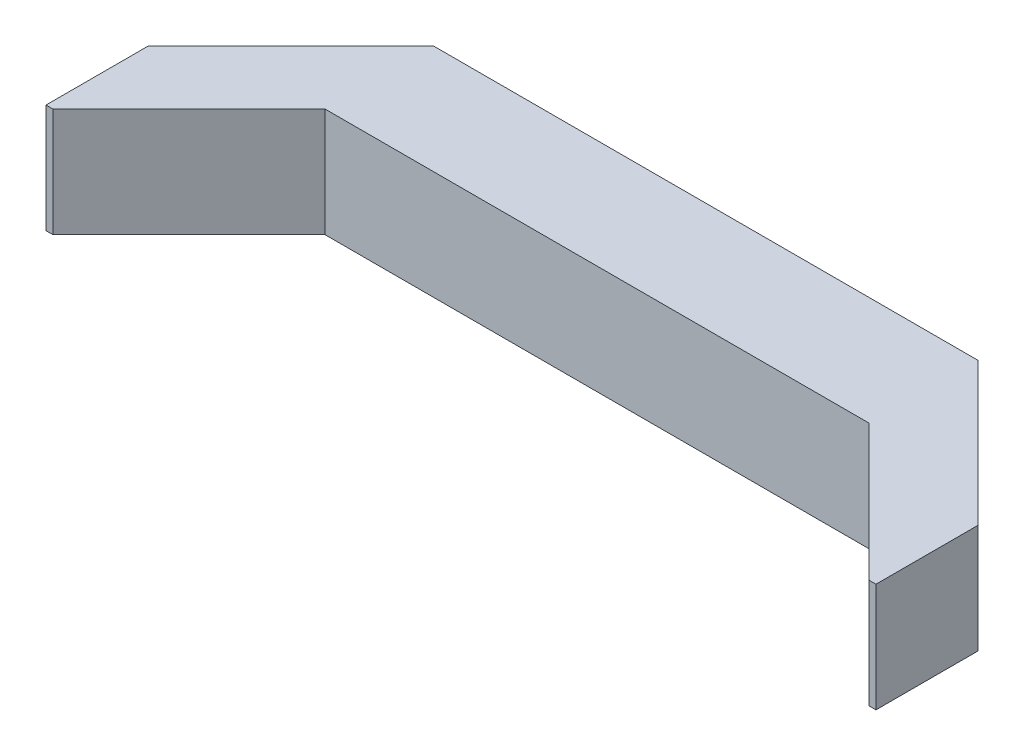
ISO-10303-21;
HEADER;
FILE_DESCRIPTION(('STEP AP214'),'2;1');
FILE_NAME('part.step','',(''),(''),'','','');
FILE_SCHEMA(('AUTOMOTIVE_DESIGN { 1 0 10303 214 1 1 1 1 }'));
ENDSEC;
DATA;
#1=APPLICATION_CONTEXT('core data for automotive mechanical design processes');
#2=APPLICATION_PROTOCOL_DEFINITION('international standard','automotive_design',2000,#1);
#3=PRODUCT_CONTEXT('',#1,'mechanical');
#4=PRODUCT('Part','Part','',(#3));
#5=PRODUCT_RELATED_PRODUCT_CATEGORY('part','',(#4));
#6=PRODUCT_DEFINITION_FORMATION('','',#4);
#7=PRODUCT_DEFINITION_CONTEXT('part definition',#1,'design');
#8=PRODUCT_DEFINITION('design','',#6,#7);
#9=PRODUCT_DEFINITION_SHAPE('','',#8);
#10=(LENGTH_UNIT() NAMED_UNIT(*) SI_UNIT(.MILLI.,.METRE.));
#11=(NAMED_UNIT(*) PLANE_ANGLE_UNIT() SI_UNIT($,.RADIAN.));
#12=(NAMED_UNIT(*) SI_UNIT($,.STERADIAN.) SOLID_ANGLE_UNIT());
#13=UNCERTAINTY_MEASURE_WITH_UNIT(LENGTH_MEASURE(1.E-05),#10,'distance_accuracy_value','');
#14=(GEOMETRIC_REPRESENTATION_CONTEXT(3) GLOBAL_UNCERTAINTY_ASSIGNED_CONTEXT((#13)) GLOBAL_UNIT_ASSIGNED_CONTEXT((#10,
#11,#12)) REPRESENTATION_CONTEXT('',''));
#15=CARTESIAN_POINT('',(0.,0.,0.));
#16=DIRECTION('',(0.,0.,1.));
#17=DIRECTION('',(1.,0.,0.));
#18=AXIS2_PLACEMENT_3D('',#15,#16,#17);
#19=CARTESIAN_POINT('',(0.,0.,406.4));
#20=DIRECTION('',(0.,1.,0.));
#21=DIRECTION('',(0.,0.,1.));
#22=AXIS2_PLACEMENT_3D('',#19,#20,#21);
#23=PLANE('',#22);
#24=DIRECTION('',(1.,0.,0.));
#25=VECTOR('',#24,1.);
#26=CARTESIAN_POINT('',(0.,0.,0.));
#27=LINE('',#26,#25);
#28=CARTESIAN_POINT('',(0.,0.,0.));
#29=VERTEX_POINT('',#28);
#30=CARTESIAN_POINT('',(2032.,0.,0.));
#31=VERTEX_POINT('',#30);
#32=EDGE_CURVE('E61',#29,#31,#27,.T.);
#33=ORIENTED_EDGE('',*,*,#32,.T.);
#34=DIRECTION('',(0.707106781186549,0.,0.707106781186546));
#35=VECTOR('',#34,1.);
#36=CARTESIAN_POINT('',(2565.4,0.,533.4));
#37=LINE('',#36,#35);
#38=CARTESIAN_POINT('',(2565.4,0.,533.4));
#39=VERTEX_POINT('',#38);
#40=EDGE_CURVE('E162',#31,#39,#37,.T.);
#41=ORIENTED_EDGE('',*,*,#40,.T.);
#42=DIRECTION('',(0.,0.,1.));
#43=VECTOR('',#42,1.);
#44=CARTESIAN_POINT('',(2565.4,0.,914.4));
#45=LINE('',#44,#43);
#46=CARTESIAN_POINT('',(2565.4,0.,914.4));
#47=VERTEX_POINT('',#46);
#48=EDGE_CURVE('E177',#39,#47,#45,.T.);
#49=ORIENTED_EDGE('',*,*,#48,.T.);
#50=DIRECTION('',(-1.,0.,0.));
#51=VECTOR('',#50,1.);
#52=CARTESIAN_POINT('',(2539.99999999999,0.,914.4));
#53=LINE('',#52,#51);
#54=CARTESIAN_POINT('',(2539.99999999999,0.,914.4));
#55=VERTEX_POINT('',#54);
#56=EDGE_CURVE('E106',#47,#55,#53,.T.);
#57=ORIENTED_EDGE('',*,*,#56,.T.);
#58=DIRECTION('',(-0.707106781186544,0.,-0.707106781186552));
#59=VECTOR('',#58,1.);
#60=CARTESIAN_POINT('',(2032.,0.,406.4));
#61=LINE('',#60,#59);
#62=CARTESIAN_POINT('',(2032.,0.,406.4));
#63=VERTEX_POINT('',#62);
#64=EDGE_CURVE('E102',#55,#63,#61,.T.);
#65=ORIENTED_EDGE('',*,*,#64,.T.);
#66=DIRECTION('',(1.,0.,0.));
#67=VECTOR('',#66,1.);
#68=CARTESIAN_POINT('',(0.,0.,406.4));
#69=LINE('',#68,#67);
#70=CARTESIAN_POINT('',(0.,0.,406.4));
#71=VERTEX_POINT('',#70);
#72=EDGE_CURVE('E92',#71,#63,#69,.T.);
#73=ORIENTED_EDGE('',*,*,#72,.F.);
#74=DIRECTION('',(0.707106781186544,0.,-0.707106781186552));
#75=VECTOR('',#74,1.);
#76=CARTESIAN_POINT('',(0.,0.,406.4));
#77=LINE('',#76,#75);
#78=CARTESIAN_POINT('',(-507.999999999994,0.,914.4));
#79=VERTEX_POINT('',#78);
#80=EDGE_CURVE('E135',#79,#71,#77,.T.);
#81=ORIENTED_EDGE('',*,*,#80,.F.);
#82=DIRECTION('',(1.,0.,0.));
#83=VECTOR('',#82,1.);
#84=CARTESIAN_POINT('',(-507.999999999994,0.,914.4));
#85=LINE('',#84,#83);
#86=CARTESIAN_POINT('',(-533.400000000002,0.,914.4));
#87=VERTEX_POINT('',#86);
#88=EDGE_CURVE('E152',#87,#79,#85,.T.);
#89=ORIENTED_EDGE('',*,*,#88,.F.);
#90=DIRECTION('',(0.,0.,1.));
#91=VECTOR('',#90,1.);
#92=CARTESIAN_POINT('',(-533.400000000002,0.,914.4));
#93=LINE('',#92,#91);
#94=CARTESIAN_POINT('',(-533.400000000002,0.,533.4));
#95=VERTEX_POINT('',#94);
#96=EDGE_CURVE('E154',#95,#87,#93,.T.);
#97=ORIENTED_EDGE('',*,*,#96,.F.);
#98=DIRECTION('',(-0.707106781186549,0.,0.707106781186546));
#99=VECTOR('',#98,1.);
#100=CARTESIAN_POINT('',(-533.400000000002,0.,533.4));
#101=LINE('',#100,#99);
#102=EDGE_CURVE('E141',#29,#95,#101,.T.);
#103=ORIENTED_EDGE('',*,*,#102,.F.);
#104=EDGE_LOOP('',(#33,#41,#49,#57,#65,#73,#81,#89,#97,#103));
#105=FACE_BOUND('',#104,.T.);
#106=ADVANCED_FACE('F33',(#105),#23,.F.);
#107=CARTESIAN_POINT('',(2032.,406.4,406.4));
#108=DIRECTION('',(0.,-1.,0.));
#109=DIRECTION('',(0.,0.,-1.));
#110=AXIS2_PLACEMENT_3D('',#107,#108,#109);
#111=PLANE('',#110);
#112=DIRECTION('',(-1.,0.,0.));
#113=VECTOR('',#112,1.);
#114=CARTESIAN_POINT('',(2032.,406.4,0.));
#115=LINE('',#114,#113);
#116=CARTESIAN_POINT('',(2032.,406.4,0.));
#117=VERTEX_POINT('',#116);
#118=CARTESIAN_POINT('',(0.,406.4,0.));
#119=VERTEX_POINT('',#118);
#120=EDGE_CURVE('E36',#117,#119,#115,.T.);
#121=ORIENTED_EDGE('',*,*,#120,.T.);
#122=DIRECTION('',(-0.707106781186549,0.,0.707106781186546));
#123=VECTOR('',#122,1.);
#124=CARTESIAN_POINT('',(-533.400000000002,406.4,533.4));
#125=LINE('',#124,#123);
#126=CARTESIAN_POINT('',(-533.400000000002,406.4,533.4));
#127=VERTEX_POINT('',#126);
#128=EDGE_CURVE('E148',#119,#127,#125,.T.);
#129=ORIENTED_EDGE('',*,*,#128,.T.);
#130=DIRECTION('',(0.,0.,1.));
#131=VECTOR('',#130,1.);
#132=CARTESIAN_POINT('',(-533.400000000002,406.4,914.4));
#133=LINE('',#132,#131);
#134=CARTESIAN_POINT('',(-533.400000000002,406.4,914.4));
#135=VERTEX_POINT('',#134);
#136=EDGE_CURVE('E145',#127,#135,#133,.T.);
#137=ORIENTED_EDGE('',*,*,#136,.T.);
#138=DIRECTION('',(1.,0.,0.));
#139=VECTOR('',#138,1.);
#140=CARTESIAN_POINT('',(-507.999999999994,406.4,914.4));
#141=LINE('',#140,#139);
#142=CARTESIAN_POINT('',(-507.999999999994,406.4,914.4));
#143=VERTEX_POINT('',#142);
#144=EDGE_CURVE('E142',#135,#143,#141,.T.);
#145=ORIENTED_EDGE('',*,*,#144,.T.);
#146=DIRECTION('',(0.707106781186544,0.,-0.707106781186552));
#147=VECTOR('',#146,1.);
#148=CARTESIAN_POINT('',(0.,406.4,406.4));
#149=LINE('',#148,#147);
#150=CARTESIAN_POINT('',(0.,406.4,406.4));
#151=VERTEX_POINT('',#150);
#152=EDGE_CURVE('E138',#143,#151,#149,.T.);
#153=ORIENTED_EDGE('',*,*,#152,.T.);
#154=DIRECTION('',(-1.,0.,0.));
#155=VECTOR('',#154,1.);
#156=CARTESIAN_POINT('',(2032.,406.4,406.4));
#157=LINE('',#156,#155);
#158=CARTESIAN_POINT('',(2032.,406.4,406.4));
#159=VERTEX_POINT('',#158);
#160=EDGE_CURVE('E11',#159,#151,#157,.T.);
#161=ORIENTED_EDGE('',*,*,#160,.F.);
#162=DIRECTION('',(-0.707106781186544,0.,-0.707106781186552));
#163=VECTOR('',#162,1.);
#164=CARTESIAN_POINT('',(2032.,406.4,406.4));
#165=LINE('',#164,#163);
#166=CARTESIAN_POINT('',(2539.99999999999,406.4,914.4));
#167=VERTEX_POINT('',#166);
#168=EDGE_CURVE('E115',#167,#159,#165,.T.);
#169=ORIENTED_EDGE('',*,*,#168,.F.);
#170=DIRECTION('',(-1.,0.,0.));
#171=VECTOR('',#170,1.);
#172=CARTESIAN_POINT('',(2539.99999999999,406.4,914.4));
#173=LINE('',#172,#171);
#174=CARTESIAN_POINT('',(2565.4,406.4,914.4));
#175=VERTEX_POINT('',#174);
#176=EDGE_CURVE('E171',#175,#167,#173,.T.);
#177=ORIENTED_EDGE('',*,*,#176,.F.);
#178=DIRECTION('',(0.,0.,1.));
#179=VECTOR('',#178,1.);
#180=CARTESIAN_POINT('',(2565.4,406.4,914.4));
#181=LINE('',#180,#179);
#182=CARTESIAN_POINT('',(2565.4,406.4,533.4));
#183=VERTEX_POINT('',#182);
#184=EDGE_CURVE('E168',#183,#175,#181,.T.);
#185=ORIENTED_EDGE('',*,*,#184,.F.);
#186=DIRECTION('',(0.707106781186549,0.,0.707106781186546));
#187=VECTOR('',#186,1.);
#188=CARTESIAN_POINT('',(2565.4,406.4,533.4));
#189=LINE('',#188,#187);
#190=EDGE_CURVE('E110',#117,#183,#189,.T.);
#191=ORIENTED_EDGE('',*,*,#190,.F.);
#192=EDGE_LOOP('',(#121,#129,#137,#145,#153,#161,#169,#177,#185,#191));
#193=FACE_BOUND('',#192,.T.);
#194=ADVANCED_FACE('F196',(#193),#111,.F.);
#195=CARTESIAN_POINT('',(0.,0.,406.4));
#196=DIRECTION('',(0.,0.,1.));
#197=DIRECTION('',(1.,0.,0.));
#198=AXIS2_PLACEMENT_3D('',#195,#196,#197);
#199=PLANE('',#198);
#200=DIRECTION('',(0.,-1.,0.));
#201=VECTOR('',#200,1.);
#202=CARTESIAN_POINT('',(0.,0.,406.4));
#203=LINE('',#202,#201);
#204=EDGE_CURVE('E96',#151,#71,#203,.T.);
#205=ORIENTED_EDGE('',*,*,#204,.T.);
#206=ORIENTED_EDGE('',*,*,#72,.T.);
#207=DIRECTION('',(0.,1.,0.));
#208=VECTOR('',#207,1.);
#209=CARTESIAN_POINT('',(2032.,0.,406.4));
#210=LINE('',#209,#208);
#211=EDGE_CURVE('E42',#63,#159,#210,.T.);
#212=ORIENTED_EDGE('',*,*,#211,.T.);
#213=ORIENTED_EDGE('',*,*,#160,.T.);
#214=EDGE_LOOP('',(#205,#206,#212,#213));
#215=FACE_BOUND('',#214,.T.);
#216=ADVANCED_FACE('F94',(#215),#199,.T.);
#217=CARTESIAN_POINT('',(0.,0.,0.));
#218=DIRECTION('',(0.,0.,1.));
#219=DIRECTION('',(1.,0.,0.));
#220=AXIS2_PLACEMENT_3D('',#217,#218,#219);
#221=PLANE('',#220);
#222=DIRECTION('',(0.,-1.,0.));
#223=VECTOR('',#222,1.);
#224=CARTESIAN_POINT('',(0.,0.,0.));
#225=LINE('',#224,#223);
#226=EDGE_CURVE('E119',#119,#29,#225,.T.);
#227=ORIENTED_EDGE('',*,*,#226,.F.);
#228=ORIENTED_EDGE('',*,*,#120,.F.);
#229=DIRECTION('',(0.,1.,0.));
#230=VECTOR('',#229,1.);
#231=CARTESIAN_POINT('',(2032.,0.,0.));
#232=LINE('',#231,#230);
#233=EDGE_CURVE('E121',#31,#117,#232,.T.);
#234=ORIENTED_EDGE('',*,*,#233,.F.);
#235=ORIENTED_EDGE('',*,*,#32,.F.);
#236=EDGE_LOOP('',(#227,#228,#234,#235));
#237=FACE_BOUND('',#236,.T.);
#238=ADVANCED_FACE('F229',(#237),#221,.F.);
#239=CARTESIAN_POINT('',(0.,0.,406.4));
#240=DIRECTION('',(0.707106781186551,0.,0.707106781186544));
#241=DIRECTION('',(0.707106781186544,0.,-0.707106781186551));
#242=AXIS2_PLACEMENT_3D('',#239,#240,#241);
#243=PLANE('',#242);
#244=ORIENTED_EDGE('',*,*,#152,.F.);
#245=DIRECTION('',(0.,1.,0.));
#246=VECTOR('',#245,1.);
#247=CARTESIAN_POINT('',(-507.999999999994,0.,914.4));
#248=LINE('',#247,#246);
#249=EDGE_CURVE('E72',#79,#143,#248,.T.);
#250=ORIENTED_EDGE('',*,*,#249,.F.);
#251=ORIENTED_EDGE('',*,*,#80,.T.);
#252=ORIENTED_EDGE('',*,*,#204,.F.);
#253=EDGE_LOOP('',(#244,#250,#251,#252));
#254=FACE_BOUND('',#253,.T.);
#255=ADVANCED_FACE('F198',(#254),#243,.T.);
#256=CARTESIAN_POINT('',(-507.999999999994,0.,914.4));
#257=DIRECTION('',(0.,0.,1.));
#258=DIRECTION('',(1.,0.,0.));
#259=AXIS2_PLACEMENT_3D('',#256,#257,#258);
#260=PLANE('',#259);
#261=ORIENTED_EDGE('',*,*,#144,.F.);
#262=DIRECTION('',(0.,1.,0.));
#263=VECTOR('',#262,1.);
#264=CARTESIAN_POINT('',(-533.400000000002,0.,914.4));
#265=LINE('',#264,#263);
#266=EDGE_CURVE('E134',#87,#135,#265,.T.);
#267=ORIENTED_EDGE('',*,*,#266,.F.);
#268=ORIENTED_EDGE('',*,*,#88,.T.);
#269=ORIENTED_EDGE('',*,*,#249,.T.);
#270=EDGE_LOOP('',(#261,#267,#268,#269));
#271=FACE_BOUND('',#270,.T.);
#272=ADVANCED_FACE('F236',(#271),#260,.T.);
#273=CARTESIAN_POINT('',(-533.400000000002,0.,914.4));
#274=DIRECTION('',(-1.,0.,0.));
#275=DIRECTION('',(0.,0.,1.));
#276=AXIS2_PLACEMENT_3D('',#273,#274,#275);
#277=PLANE('',#276);
#278=ORIENTED_EDGE('',*,*,#136,.F.);
#279=DIRECTION('',(0.,1.,0.));
#280=VECTOR('',#279,1.);
#281=CARTESIAN_POINT('',(-533.400000000002,0.,533.4));
#282=LINE('',#281,#280);
#283=EDGE_CURVE('E132',#95,#127,#282,.T.);
#284=ORIENTED_EDGE('',*,*,#283,.F.);
#285=ORIENTED_EDGE('',*,*,#96,.T.);
#286=ORIENTED_EDGE('',*,*,#266,.T.);
#287=EDGE_LOOP('',(#278,#284,#285,#286));
#288=FACE_BOUND('',#287,.T.);
#289=ADVANCED_FACE('F206',(#288),#277,.T.);
#290=CARTESIAN_POINT('',(-533.400000000002,0.,533.4));
#291=DIRECTION('',(-0.707106781186546,0.,-0.707106781186549));
#292=DIRECTION('',(-0.707106781186549,0.,0.707106781186546));
#293=AXIS2_PLACEMENT_3D('',#290,#291,#292);
#294=PLANE('',#293);
#295=ORIENTED_EDGE('',*,*,#128,.F.);
#296=ORIENTED_EDGE('',*,*,#226,.T.);
#297=ORIENTED_EDGE('',*,*,#102,.T.);
#298=ORIENTED_EDGE('',*,*,#283,.T.);
#299=EDGE_LOOP('',(#295,#296,#297,#298));
#300=FACE_BOUND('',#299,.T.);
#301=ADVANCED_FACE('F208',(#300),#294,.T.);
#302=CARTESIAN_POINT('',(2565.4,0.,533.4));
#303=DIRECTION('',(-0.707106781186546,0.,0.707106781186549));
#304=DIRECTION('',(0.707106781186549,0.,0.707106781186546));
#305=AXIS2_PLACEMENT_3D('',#302,#303,#304);
#306=PLANE('',#305);
#307=ORIENTED_EDGE('',*,*,#190,.T.);
#308=DIRECTION('',(0.,1.,0.));
#309=VECTOR('',#308,1.);
#310=CARTESIAN_POINT('',(2565.4,0.,533.4));
#311=LINE('',#310,#309);
#312=EDGE_CURVE('E150',#39,#183,#311,.T.);
#313=ORIENTED_EDGE('',*,*,#312,.F.);
#314=ORIENTED_EDGE('',*,*,#40,.F.);
#315=ORIENTED_EDGE('',*,*,#233,.T.);
#316=EDGE_LOOP('',(#307,#313,#314,#315));
#317=FACE_BOUND('',#316,.T.);
#318=ADVANCED_FACE('F210',(#317),#306,.F.);
#319=CARTESIAN_POINT('',(2565.4,0.,914.4));
#320=DIRECTION('',(-1.,0.,0.));
#321=DIRECTION('',(0.,0.,1.));
#322=AXIS2_PLACEMENT_3D('',#319,#320,#321);
#323=PLANE('',#322);
#324=ORIENTED_EDGE('',*,*,#184,.T.);
#325=DIRECTION('',(0.,1.,0.));
#326=VECTOR('',#325,1.);
#327=CARTESIAN_POINT('',(2565.4,0.,914.4));
#328=LINE('',#327,#326);
#329=EDGE_CURVE('E161',#47,#175,#328,.T.);
#330=ORIENTED_EDGE('',*,*,#329,.F.);
#331=ORIENTED_EDGE('',*,*,#48,.F.);
#332=ORIENTED_EDGE('',*,*,#312,.T.);
#333=EDGE_LOOP('',(#324,#330,#331,#332));
#334=FACE_BOUND('',#333,.T.);
#335=ADVANCED_FACE('F186',(#334),#323,.F.);
#336=CARTESIAN_POINT('',(2539.99999999999,0.,914.4));
#337=DIRECTION('',(0.,0.,-1.));
#338=DIRECTION('',(-1.,0.,0.));
#339=AXIS2_PLACEMENT_3D('',#336,#337,#338);
#340=PLANE('',#339);
#341=ORIENTED_EDGE('',*,*,#176,.T.);
#342=DIRECTION('',(0.,1.,0.));
#343=VECTOR('',#342,1.);
#344=CARTESIAN_POINT('',(2539.99999999999,0.,914.4));
#345=LINE('',#344,#343);
#346=EDGE_CURVE('E159',#55,#167,#345,.T.);
#347=ORIENTED_EDGE('',*,*,#346,.F.);
#348=ORIENTED_EDGE('',*,*,#56,.F.);
#349=ORIENTED_EDGE('',*,*,#329,.T.);
#350=EDGE_LOOP('',(#341,#347,#348,#349));
#351=FACE_BOUND('',#350,.T.);
#352=ADVANCED_FACE('F191',(#351),#340,.F.);
#353=CARTESIAN_POINT('',(2032.,0.,406.4));
#354=DIRECTION('',(0.707106781186551,0.,-0.707106781186544));
#355=DIRECTION('',(-0.707106781186544,0.,-0.707106781186551));
#356=AXIS2_PLACEMENT_3D('',#353,#354,#355);
#357=PLANE('',#356);
#358=ORIENTED_EDGE('',*,*,#168,.T.);
#359=ORIENTED_EDGE('',*,*,#211,.F.);
#360=ORIENTED_EDGE('',*,*,#64,.F.);
#361=ORIENTED_EDGE('',*,*,#346,.T.);
#362=EDGE_LOOP('',(#358,#359,#360,#361));
#363=FACE_BOUND('',#362,.T.);
#364=ADVANCED_FACE('F113',(#363),#357,.F.);
#365=CLOSED_SHELL('',(#106,#194,#216,#238,#255,#272,#289,#301,#318,#335,#352,#364));
#366=MANIFOLD_SOLID_BREP('B2',#365);
#367=ADVANCED_BREP_SHAPE_REPRESENTATION('',(#18,#366),#14);
#368=SHAPE_DEFINITION_REPRESENTATION(#9,#367);
ENDSEC;
END-ISO-10303-21;
